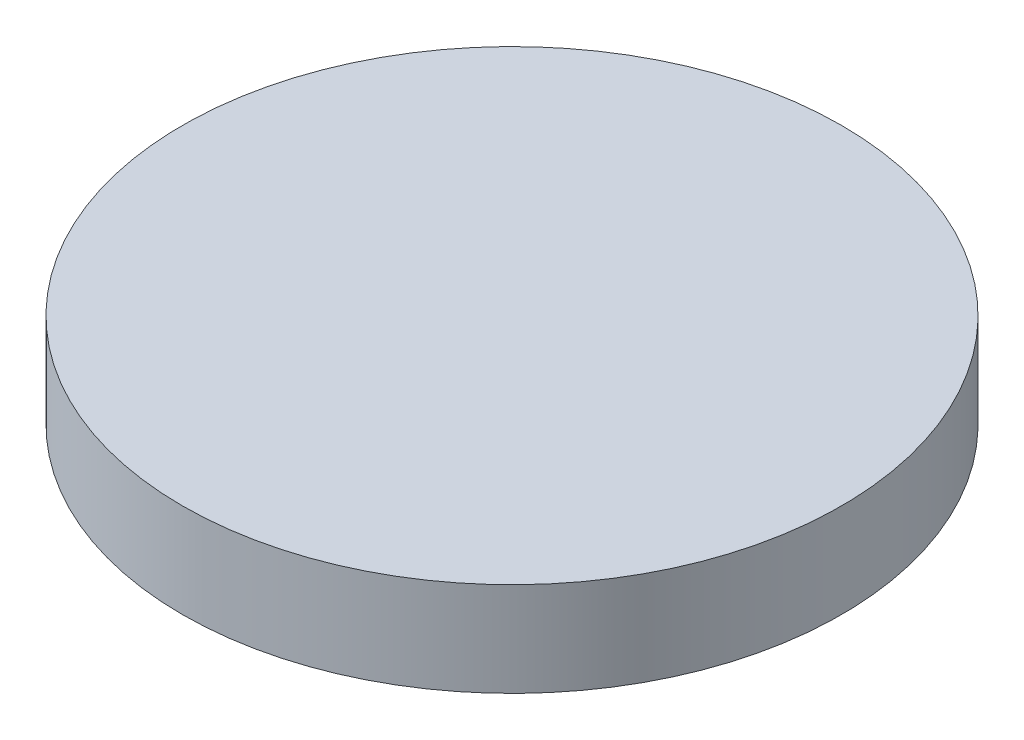
ISO-10303-21;
HEADER;
FILE_DESCRIPTION(('STEP AP214'),'2;1');
FILE_NAME('part.step','',(''),(''),'','','');
FILE_SCHEMA(('AUTOMOTIVE_DESIGN { 1 0 10303 214 1 1 1 1 }'));
ENDSEC;
DATA;
#1=APPLICATION_CONTEXT('core data for automotive mechanical design processes');
#2=APPLICATION_PROTOCOL_DEFINITION('international standard','automotive_design',2000,#1);
#3=PRODUCT_CONTEXT('',#1,'mechanical');
#4=PRODUCT('Part','Part','',(#3));
#5=PRODUCT_RELATED_PRODUCT_CATEGORY('part','',(#4));
#6=PRODUCT_DEFINITION_FORMATION('','',#4);
#7=PRODUCT_DEFINITION_CONTEXT('part definition',#1,'design');
#8=PRODUCT_DEFINITION('design','',#6,#7);
#9=PRODUCT_DEFINITION_SHAPE('','',#8);
#10=(LENGTH_UNIT() NAMED_UNIT(*) SI_UNIT(.MILLI.,.METRE.));
#11=(NAMED_UNIT(*) PLANE_ANGLE_UNIT() SI_UNIT($,.RADIAN.));
#12=(NAMED_UNIT(*) SI_UNIT($,.STERADIAN.) SOLID_ANGLE_UNIT());
#13=UNCERTAINTY_MEASURE_WITH_UNIT(LENGTH_MEASURE(1.E-05),#10,'distance_accuracy_value','');
#14=(GEOMETRIC_REPRESENTATION_CONTEXT(3) GLOBAL_UNCERTAINTY_ASSIGNED_CONTEXT((#13)) GLOBAL_UNIT_ASSIGNED_CONTEXT((#10,
#11,#12)) REPRESENTATION_CONTEXT('',''));
#15=CARTESIAN_POINT('',(0.,0.,0.));
#16=DIRECTION('',(0.,0.,1.));
#17=DIRECTION('',(1.,0.,0.));
#18=AXIS2_PLACEMENT_3D('',#15,#16,#17);
#19=CARTESIAN_POINT('',(0.,2.,0.));
#20=DIRECTION('',(0.,-1.,0.));
#21=DIRECTION('',(0.,0.,-1.));
#22=AXIS2_PLACEMENT_3D('',#19,#20,#21);
#23=CYLINDRICAL_SURFACE('',#22,7.);
#24=CARTESIAN_POINT('',(0.,2.,0.));
#25=DIRECTION('',(0.,1.,0.));
#26=DIRECTION('',(0.,0.,1.));
#27=AXIS2_PLACEMENT_3D('',#24,#25,#26);
#28=CIRCLE('',#27,7.);
#29=CARTESIAN_POINT('',(0.,2.,7.));
#30=VERTEX_POINT('',#29);
#31=EDGE_CURVE('E10',#30,#30,#28,.T.);
#32=ORIENTED_EDGE('',*,*,#31,.F.);
#33=EDGE_LOOP('',(#32));
#34=FACE_BOUND('',#33,.T.);
#35=CARTESIAN_POINT('',(0.,0.,0.));
#36=DIRECTION('',(0.,1.,0.));
#37=DIRECTION('',(0.,0.,1.));
#38=AXIS2_PLACEMENT_3D('',#35,#36,#37);
#39=CIRCLE('',#38,7.);
#40=CARTESIAN_POINT('',(0.,0.,7.));
#41=VERTEX_POINT('',#40);
#42=EDGE_CURVE('E42',#41,#41,#39,.T.);
#43=ORIENTED_EDGE('',*,*,#42,.T.);
#44=EDGE_LOOP('',(#43));
#45=FACE_BOUND('',#44,.T.);
#46=ADVANCED_FACE('F39',(#34,#45),#23,.T.);
#47=CARTESIAN_POINT('',(0.,2.,0.));
#48=DIRECTION('',(0.,1.,0.));
#49=DIRECTION('',(0.,0.,1.));
#50=AXIS2_PLACEMENT_3D('',#47,#48,#49);
#51=PLANE('',#50);
#52=ORIENTED_EDGE('',*,*,#31,.T.);
#53=EDGE_LOOP('',(#52));
#54=FACE_BOUND('',#53,.T.);
#55=ADVANCED_FACE('F56',(#54),#51,.T.);
#56=CARTESIAN_POINT('',(0.,0.,0.));
#57=DIRECTION('',(0.,1.,0.));
#58=DIRECTION('',(0.,0.,1.));
#59=AXIS2_PLACEMENT_3D('',#56,#57,#58);
#60=PLANE('',#59);
#61=ORIENTED_EDGE('',*,*,#42,.F.);
#62=EDGE_LOOP('',(#61));
#63=FACE_BOUND('',#62,.T.);
#64=ADVANCED_FACE('F54',(#63),#60,.F.);
#65=CLOSED_SHELL('',(#46,#55,#64));
#66=MANIFOLD_SOLID_BREP('B2',#65);
#67=ADVANCED_BREP_SHAPE_REPRESENTATION('',(#18,#66),#14);
#68=SHAPE_DEFINITION_REPRESENTATION(#9,#67);
ENDSEC;
END-ISO-10303-21;
